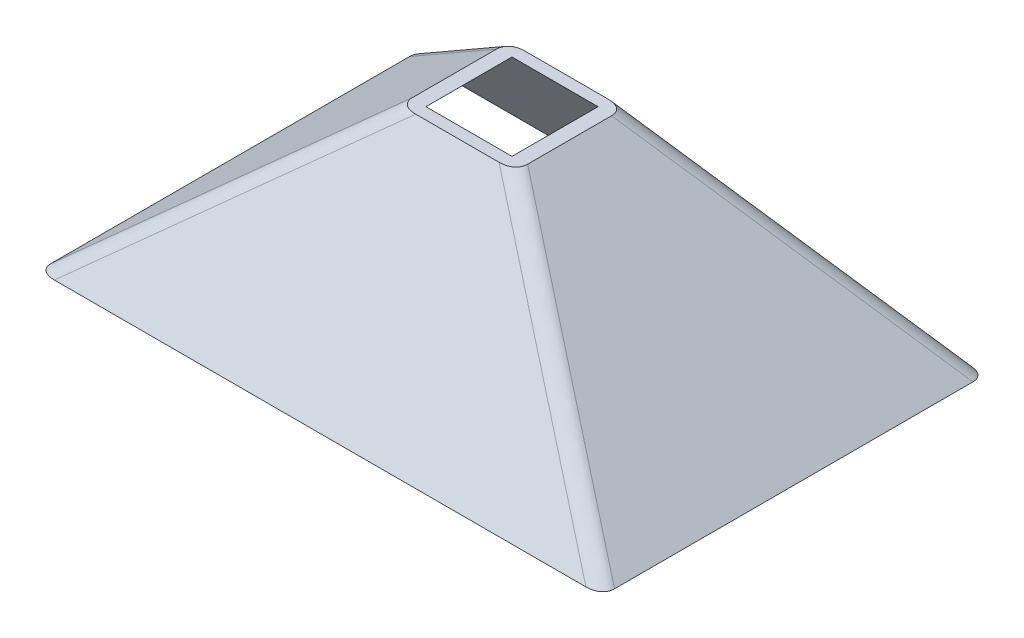
ISO-10303-21;
HEADER;
FILE_DESCRIPTION(('STEP AP214'),'2;1');
FILE_NAME('part.step','',(''),(''),'','','');
FILE_SCHEMA(('AUTOMOTIVE_DESIGN { 1 0 10303 214 1 1 1 1 }'));
ENDSEC;
DATA;
#1=APPLICATION_CONTEXT('core data for automotive mechanical design processes');
#2=APPLICATION_PROTOCOL_DEFINITION('international standard','automotive_design',2000,#1);
#3=PRODUCT_CONTEXT('',#1,'mechanical');
#4=PRODUCT('Part','Part','',(#3));
#5=PRODUCT_RELATED_PRODUCT_CATEGORY('part','',(#4));
#6=PRODUCT_DEFINITION_FORMATION('','',#4);
#7=PRODUCT_DEFINITION_CONTEXT('part definition',#1,'design');
#8=PRODUCT_DEFINITION('design','',#6,#7);
#9=PRODUCT_DEFINITION_SHAPE('','',#8);
#10=(LENGTH_UNIT() NAMED_UNIT(*) SI_UNIT(.MILLI.,.METRE.));
#11=(NAMED_UNIT(*) PLANE_ANGLE_UNIT() SI_UNIT($,.RADIAN.));
#12=(NAMED_UNIT(*) SI_UNIT($,.STERADIAN.) SOLID_ANGLE_UNIT());
#13=UNCERTAINTY_MEASURE_WITH_UNIT(LENGTH_MEASURE(1.E-05),#10,'distance_accuracy_value','');
#14=(GEOMETRIC_REPRESENTATION_CONTEXT(3) GLOBAL_UNCERTAINTY_ASSIGNED_CONTEXT((#13)) GLOBAL_UNIT_ASSIGNED_CONTEXT((#10,
#11,#12)) REPRESENTATION_CONTEXT('',''));
#15=CARTESIAN_POINT('',(0.,0.,0.));
#16=DIRECTION('',(0.,0.,1.));
#17=DIRECTION('',(1.,0.,0.));
#18=AXIS2_PLACEMENT_3D('',#15,#16,#17);
#19=CARTESIAN_POINT('',(850.,-50.,-525.));
#20=DIRECTION('',(0.,1.,0.));
#21=DIRECTION('',(-1.,0.,0.));
#22=AXIS2_PLACEMENT_3D('',#19,#20,#21);
#23=PLANE('',#22);
#24=DIRECTION('',(-1.,0.,0.));
#25=VECTOR('',#24,1.);
#26=CARTESIAN_POINT('',(-850.,-50.0000000000003,51.2791026741974));
#27=LINE('',#26,#25);
#28=CARTESIAN_POINT('',(71.0344398835073,-50.0000000000001,51.2791026741973));
#29=VERTEX_POINT('',#28);
#30=CARTESIAN_POINT('',(-71.0344398835072,-50.0000000000002,51.2791026741973));
#31=VERTEX_POINT('',#30);
#32=EDGE_CURVE('E219',#29,#31,#27,.T.);
#33=ORIENTED_EDGE('',*,*,#32,.T.);
#34=CARTESIAN_POINT('',(-67.4918462685022,-50.0000000000001,45.0780401829455));
#35=DIRECTION('',(0.,1.,0.));
#36=DIRECTION('',(0.852791218594574,0.,-0.522251986581173));
#37=AXIS2_PLACEMENT_3D('',#34,#35,#36);
#38=ELLIPSE('',#37,8.62117853821362,5.);
#39=CARTESIAN_POINT('',(-75.2938680172123,-50.,47.8937006739439));
#40=VERTEX_POINT('',#39);
#41=EDGE_CURVE('E263',#31,#40,#38,.F.);
#42=ORIENTED_EDGE('',*,*,#41,.T.);
#43=DIRECTION('',(0.,0.,-1.));
#44=VECTOR('',#43,1.);
#45=CARTESIAN_POINT('',(-75.2938680172124,-50.,-525.));
#46=LINE('',#45,#44);
#47=CARTESIAN_POINT('',(-75.2938680172123,-50.,-47.8937006739441));
#48=VERTEX_POINT('',#47);
#49=EDGE_CURVE('E224',#40,#48,#46,.T.);
#50=ORIENTED_EDGE('',*,*,#49,.T.);
#51=CARTESIAN_POINT('',(-67.4918462685025,-50.0000000000002,-45.0780401829455));
#52=DIRECTION('',(0.,1.,0.));
#53=DIRECTION('',(0.852791218594574,0.,0.522251986581173));
#54=AXIS2_PLACEMENT_3D('',#51,#52,#53);
#55=ELLIPSE('',#54,8.62117853821362,5.);
#56=CARTESIAN_POINT('',(-71.0344398835074,-50.0000000000002,-51.2791026741973));
#57=VERTEX_POINT('',#56);
#58=EDGE_CURVE('E258',#48,#57,#55,.F.);
#59=ORIENTED_EDGE('',*,*,#58,.T.);
#60=DIRECTION('',(1.,0.,0.));
#61=VECTOR('',#60,1.);
#62=CARTESIAN_POINT('',(849.999999999999,-50.,-51.2791026741972));
#63=LINE('',#62,#61);
#64=CARTESIAN_POINT('',(71.0344398835072,-50.0000000000001,-51.2791026741972));
#65=VERTEX_POINT('',#64);
#66=EDGE_CURVE('E189',#57,#65,#63,.T.);
#67=ORIENTED_EDGE('',*,*,#66,.T.);
#68=CARTESIAN_POINT('',(67.4918462685022,-50.0000000000002,-45.0780401829456));
#69=DIRECTION('',(0.,1.,0.));
#70=DIRECTION('',(-0.852791218594574,0.,0.522251986581174));
#71=AXIS2_PLACEMENT_3D('',#68,#69,#70);
#72=ELLIPSE('',#71,8.62117853821362,5.);
#73=CARTESIAN_POINT('',(75.2938680172124,-50.0000000000002,-47.8937006739442));
#74=VERTEX_POINT('',#73);
#75=EDGE_CURVE('E110',#65,#74,#72,.F.);
#76=ORIENTED_EDGE('',*,*,#75,.T.);
#77=DIRECTION('',(0.,0.,1.));
#78=VECTOR('',#77,1.);
#79=CARTESIAN_POINT('',(75.2938680172125,-50.0000000000002,525.));
#80=LINE('',#79,#78);
#81=CARTESIAN_POINT('',(75.2938680172124,-50.0000000000002,47.8937006739442));
#82=VERTEX_POINT('',#81);
#83=EDGE_CURVE('E223',#74,#82,#80,.T.);
#84=ORIENTED_EDGE('',*,*,#83,.T.);
#85=CARTESIAN_POINT('',(67.4918462685022,-50.0000000000001,45.0780401829456));
#86=DIRECTION('',(0.,1.,0.));
#87=DIRECTION('',(-0.852791218594574,0.,-0.522251986581173));
#88=AXIS2_PLACEMENT_3D('',#85,#86,#87);
#89=ELLIPSE('',#88,8.62117853821362,5.);
#90=EDGE_CURVE('E261',#82,#29,#89,.F.);
#91=ORIENTED_EDGE('',*,*,#90,.T.);
#92=EDGE_LOOP('',(#33,#42,#50,#59,#67,#76,#84,#91));
#93=FACE_BOUND('',#92,.T.);
#94=DIRECTION('',(-1.,0.,0.));
#95=VECTOR('',#94,1.);
#96=CARTESIAN_POINT('',(-850.,-50.0000000000003,48.1785714285716));
#97=LINE('',#96,#95);
#98=CARTESIAN_POINT('',(71.3928571428573,-50.0000000000002,48.1785714285715));
#99=VERTEX_POINT('',#98);
#100=CARTESIAN_POINT('',(-71.3928571428572,-50.,48.1785714285712));
#101=VERTEX_POINT('',#100);
#102=EDGE_CURVE('E203',#99,#101,#97,.T.);
#103=ORIENTED_EDGE('',*,*,#102,.F.);
#104=DIRECTION('',(0.,0.,1.));
#105=VECTOR('',#104,1.);
#106=CARTESIAN_POINT('',(71.3928571428575,-50.0000000000002,525.));
#107=LINE('',#106,#105);
#108=CARTESIAN_POINT('',(71.3928571428571,-50.0000000000001,-48.1785714285714));
#109=VERTEX_POINT('',#108);
#110=EDGE_CURVE('E201',#109,#99,#107,.T.);
#111=ORIENTED_EDGE('',*,*,#110,.F.);
#112=DIRECTION('',(1.,0.,0.));
#113=VECTOR('',#112,1.);
#114=CARTESIAN_POINT('',(849.999999999999,-50.,-48.1785714285713));
#115=LINE('',#114,#113);
#116=CARTESIAN_POINT('',(-71.3928571428573,-50.0000000000002,-48.1785714285716));
#117=VERTEX_POINT('',#116);
#118=EDGE_CURVE('E195',#117,#109,#115,.T.);
#119=ORIENTED_EDGE('',*,*,#118,.F.);
#120=DIRECTION('',(0.,0.,-1.));
#121=VECTOR('',#120,1.);
#122=CARTESIAN_POINT('',(-71.3928571428574,-50.0000000000002,-525.));
#123=LINE('',#122,#121);
#124=EDGE_CURVE('E179',#101,#117,#123,.T.);
#125=ORIENTED_EDGE('',*,*,#124,.F.);
#126=EDGE_LOOP('',(#103,#111,#119,#125));
#127=FACE_BOUND('',#126,.T.);
#128=ADVANCED_FACE('F88',(#93,#127),#23,.F.);
#129=CARTESIAN_POINT('',(-850.,-698.521278753427,527.015783588318));
#130=DIRECTION('',(0.,0.591488498629338,0.806313435327238));
#131=DIRECTION('',(1.,0.,0.));
#132=AXIS2_PLACEMENT_3D('',#129,#130,#131);
#133=PLANE('',#132);
#134=DIRECTION('',(1.,0.,0.));
#135=VECTOR('',#134,1.);
#136=CARTESIAN_POINT('',(0.,0.,14.6005312456257));
#137=LINE('',#136,#135);
#138=CARTESIAN_POINT('',(-11.1415827406499,0.,14.6005312456257));
#139=VERTEX_POINT('',#138);
#140=CARTESIAN_POINT('',(11.1415827406499,0.,14.6005312456257));
#141=VERTEX_POINT('',#140);
#142=EDGE_CURVE('E228',#139,#141,#137,.T.);
#143=ORIENTED_EDGE('',*,*,#142,.F.);
#144=DIRECTION('',(0.694717745113158,0.579967109814204,-0.425447301270849));
#145=VECTOR('',#144,1.);
#146=CARTESIAN_POINT('',(-848.898155680097,-699.379369180218,527.645254208543));
#147=LINE('',#146,#145);
#148=EDGE_CURVE('E256',#139,#31,#147,.F.);
#149=ORIENTED_EDGE('',*,*,#148,.T.);
#150=ORIENTED_EDGE('',*,*,#32,.F.);
#151=DIRECTION('',(-0.694717745113158,0.579967109814205,-0.425447301270849));
#152=VECTOR('',#151,1.);
#153=CARTESIAN_POINT('',(28.4224885424089,-14.426516471355,25.1834115428269));
#154=LINE('',#153,#152);
#155=EDGE_CURVE('E253',#29,#141,#154,.T.);
#156=ORIENTED_EDGE('',*,*,#155,.T.);
#157=EDGE_LOOP('',(#143,#149,#150,#156));
#158=FACE_BOUND('',#157,.T.);
#159=ADVANCED_FACE('F291',(#158),#133,.T.);
#160=CARTESIAN_POINT('',(851.602148827907,-698.080854582572,525.));
#161=DIRECTION('',(0.640859531162751,0.76765816697138,0.));
#162=DIRECTION('',(0.,0.,-1.));
#163=AXIS2_PLACEMENT_3D('',#160,#161,#162);
#164=PLANE('',#163);
#165=DIRECTION('',(0.,0.,-1.));
#166=VECTOR('',#165,1.);
#167=CARTESIAN_POINT('',(15.4010108743551,0.,0.));
#168=LINE('',#167,#166);
#169=CARTESIAN_POINT('',(15.4010108743551,0.,11.2151292453726));
#170=VERTEX_POINT('',#169);
#171=CARTESIAN_POINT('',(15.4010108743551,0.,-11.2151292453726));
#172=VERTEX_POINT('',#171);
#173=EDGE_CURVE('E233',#170,#172,#168,.T.);
#174=ORIENTED_EDGE('',*,*,#173,.F.);
#175=DIRECTION('',(-0.694717745113158,0.579967109814205,-0.425447301270849));
#176=VECTOR('',#175,1.);
#177=CARTESIAN_POINT('',(852.10245333591,-698.498520838507,523.613687031907));
#178=LINE('',#177,#176);
#179=EDGE_CURVE('E103',#170,#82,#178,.F.);
#180=ORIENTED_EDGE('',*,*,#179,.T.);
#181=ORIENTED_EDGE('',*,*,#83,.F.);
#182=DIRECTION('',(-0.694717745113158,0.579967109814205,0.425447301270849));
#183=VECTOR('',#182,1.);
#184=CARTESIAN_POINT('',(541.75837404238,-439.415807057385,-333.558010565326));
#185=LINE('',#184,#183);
#186=EDGE_CURVE('E265',#74,#172,#185,.T.);
#187=ORIENTED_EDGE('',*,*,#186,.T.);
#188=EDGE_LOOP('',(#174,#180,#181,#187));
#189=FACE_BOUND('',#188,.T.);
#190=ADVANCED_FACE('F283',(#189),#164,.T.);
#191=CARTESIAN_POINT('',(850.,-698.521278753427,-527.015783588318));
#192=DIRECTION('',(0.,0.591488498629338,-0.806313435327238));
#193=DIRECTION('',(-1.,0.,0.));
#194=AXIS2_PLACEMENT_3D('',#191,#192,#193);
#195=PLANE('',#194);
#196=DIRECTION('',(-1.,0.,0.));
#197=VECTOR('',#196,1.);
#198=CARTESIAN_POINT('',(0.,0.,-14.6005312456256));
#199=LINE('',#198,#197);
#200=CARTESIAN_POINT('',(11.1415827406499,0.,-14.6005312456256));
#201=VERTEX_POINT('',#200);
#202=CARTESIAN_POINT('',(-11.1415827406501,0.,-14.6005312456256));
#203=VERTEX_POINT('',#202);
#204=EDGE_CURVE('E236',#201,#203,#199,.T.);
#205=ORIENTED_EDGE('',*,*,#204,.F.);
#206=DIRECTION('',(-0.694717745113158,0.579967109814205,0.425447301270849));
#207=VECTOR('',#206,1.);
#208=CARTESIAN_POINT('',(848.898155680096,-699.379369180218,-527.645254208543));
#209=LINE('',#208,#207);
#210=EDGE_CURVE('E12',#201,#65,#209,.F.);
#211=ORIENTED_EDGE('',*,*,#210,.T.);
#212=ORIENTED_EDGE('',*,*,#66,.F.);
#213=DIRECTION('',(0.694717745113158,0.579967109814204,0.425447301270849));
#214=VECTOR('',#213,1.);
#215=CARTESIAN_POINT('',(-28.4224885424093,-14.4265164713553,-25.183411542827));
#216=LINE('',#215,#214);
#217=EDGE_CURVE('E96',#57,#203,#216,.T.);
#218=ORIENTED_EDGE('',*,*,#217,.T.);
#219=EDGE_LOOP('',(#205,#211,#212,#218));
#220=FACE_BOUND('',#219,.T.);
#221=ADVANCED_FACE('F273',(#220),#195,.T.);
#222=CARTESIAN_POINT('',(-851.602148827907,-698.080854582572,-525.));
#223=DIRECTION('',(-0.64085953116275,0.76765816697138,0.));
#224=DIRECTION('',(0.,0.,1.));
#225=AXIS2_PLACEMENT_3D('',#222,#223,#224);
#226=PLANE('',#225);
#227=ORIENTED_EDGE('',*,*,#49,.F.);
#228=DIRECTION('',(0.694717745113158,0.579967109814204,-0.425447301270849));
#229=VECTOR('',#228,1.);
#230=CARTESIAN_POINT('',(-541.75837404238,-439.415807057385,333.558010565326));
#231=LINE('',#230,#229);
#232=CARTESIAN_POINT('',(-15.4010108743551,0.,11.2151292453726));
#233=VERTEX_POINT('',#232);
#234=EDGE_CURVE('E242',#40,#233,#231,.T.);
#235=ORIENTED_EDGE('',*,*,#234,.T.);
#236=DIRECTION('',(0.,0.,1.));
#237=VECTOR('',#236,1.);
#238=CARTESIAN_POINT('',(-15.4010108743551,0.,0.));
#239=LINE('',#238,#237);
#240=CARTESIAN_POINT('',(-15.4010108743551,0.,-11.2151292453725));
#241=VERTEX_POINT('',#240);
#242=EDGE_CURVE('E222',#241,#233,#239,.T.);
#243=ORIENTED_EDGE('',*,*,#242,.F.);
#244=DIRECTION('',(0.694717745113158,0.579967109814204,0.425447301270849));
#245=VECTOR('',#244,1.);
#246=CARTESIAN_POINT('',(-852.10245333591,-698.498520838507,-523.613687031907));
#247=LINE('',#246,#245);
#248=EDGE_CURVE('E227',#241,#48,#247,.F.);
#249=ORIENTED_EDGE('',*,*,#248,.T.);
#250=EDGE_LOOP('',(#227,#235,#243,#249));
#251=FACE_BOUND('',#250,.T.);
#252=ADVANCED_FACE('F299',(#251),#226,.T.);
#253=CARTESIAN_POINT('',(0.,0.,0.));
#254=DIRECTION('',(0.,1.,0.));
#255=DIRECTION('',(0.,0.,1.));
#256=AXIS2_PLACEMENT_3D('',#253,#254,#255);
#257=PLANE('',#256);
#258=DIRECTION('',(1.,0.,0.));
#259=VECTOR('',#258,1.);
#260=CARTESIAN_POINT('',(0.,0.,11.5));
#261=LINE('',#260,#259);
#262=CARTESIAN_POINT('',(-11.5,0.,11.5));
#263=VERTEX_POINT('',#262);
#264=CARTESIAN_POINT('',(11.5,0.,11.5));
#265=VERTEX_POINT('',#264);
#266=EDGE_CURVE('E211',#263,#265,#261,.T.);
#267=ORIENTED_EDGE('',*,*,#266,.F.);
#268=DIRECTION('',(0.,0.,1.));
#269=VECTOR('',#268,1.);
#270=CARTESIAN_POINT('',(-11.5,0.,0.));
#271=LINE('',#270,#269);
#272=CARTESIAN_POINT('',(-11.5,0.,-11.5));
#273=VERTEX_POINT('',#272);
#274=EDGE_CURVE('E207',#273,#263,#271,.T.);
#275=ORIENTED_EDGE('',*,*,#274,.F.);
#276=DIRECTION('',(-1.,0.,0.));
#277=VECTOR('',#276,1.);
#278=CARTESIAN_POINT('',(0.,0.,-11.5));
#279=LINE('',#278,#277);
#280=CARTESIAN_POINT('',(11.5,0.,-11.5));
#281=VERTEX_POINT('',#280);
#282=EDGE_CURVE('E198',#281,#273,#279,.T.);
#283=ORIENTED_EDGE('',*,*,#282,.F.);
#284=DIRECTION('',(0.,0.,-1.));
#285=VECTOR('',#284,1.);
#286=CARTESIAN_POINT('',(11.5,0.,0.));
#287=LINE('',#286,#285);
#288=EDGE_CURVE('E214',#265,#281,#287,.T.);
#289=ORIENTED_EDGE('',*,*,#288,.F.);
#290=EDGE_LOOP('',(#267,#275,#283,#289));
#291=FACE_BOUND('',#290,.T.);
#292=ORIENTED_EDGE('',*,*,#242,.T.);
#293=CARTESIAN_POINT('',(-7.59898912564494,0.,8.39946875437397));
#294=DIRECTION('',(0.,1.,0.));
#295=DIRECTION('',(0.852791218594574,0.,-0.522251986581173));
#296=AXIS2_PLACEMENT_3D('',#293,#294,#295);
#297=ELLIPSE('',#296,8.62117853821362,5.);
#298=EDGE_CURVE('E251',#233,#139,#297,.T.);
#299=ORIENTED_EDGE('',*,*,#298,.T.);
#300=ORIENTED_EDGE('',*,*,#142,.T.);
#301=CARTESIAN_POINT('',(7.59898912564493,0.,8.39946875437406));
#302=DIRECTION('',(0.,1.,0.));
#303=DIRECTION('',(-0.852791218594574,0.,-0.522251986581173));
#304=AXIS2_PLACEMENT_3D('',#301,#302,#303);
#305=ELLIPSE('',#304,8.62117853821362,5.);
#306=EDGE_CURVE('E249',#141,#170,#305,.T.);
#307=ORIENTED_EDGE('',*,*,#306,.T.);
#308=ORIENTED_EDGE('',*,*,#173,.T.);
#309=CARTESIAN_POINT('',(7.59898912564494,0.,-8.39946875437403));
#310=DIRECTION('',(0.,1.,0.));
#311=DIRECTION('',(-0.852791218594574,0.,0.522251986581173));
#312=AXIS2_PLACEMENT_3D('',#309,#310,#311);
#313=ELLIPSE('',#312,8.62117853821362,5.);
#314=EDGE_CURVE('E247',#172,#201,#313,.T.);
#315=ORIENTED_EDGE('',*,*,#314,.T.);
#316=ORIENTED_EDGE('',*,*,#204,.T.);
#317=CARTESIAN_POINT('',(-7.59898912564512,0.,-8.39946875437398));
#318=DIRECTION('',(0.,1.,0.));
#319=DIRECTION('',(0.852791218594574,0.,0.522251986581173));
#320=AXIS2_PLACEMENT_3D('',#317,#318,#319);
#321=ELLIPSE('',#320,8.62117853821362,5.);
#322=EDGE_CURVE('E245',#203,#241,#321,.T.);
#323=ORIENTED_EDGE('',*,*,#322,.T.);
#324=EDGE_LOOP('',(#292,#299,#300,#307,#308,#315,#316,#323));
#325=FACE_BOUND('',#324,.T.);
#326=ADVANCED_FACE('F278',(#291,#325),#257,.T.);
#327=CARTESIAN_POINT('',(-850.,-700.,525.));
#328=DIRECTION('',(0.,0.591488498629338,0.806313435327238));
#329=DIRECTION('',(1.,0.,0.));
#330=AXIS2_PLACEMENT_3D('',#327,#328,#329);
#331=PLANE('',#330);
#332=ORIENTED_EDGE('',*,*,#102,.T.);
#333=DIRECTION('',(0.694717745113158,0.579967109814204,-0.425447301270849));
#334=VECTOR('',#333,1.);
#335=CARTESIAN_POINT('',(-430.75,-350.,268.25));
#336=LINE('',#335,#334);
#337=EDGE_CURVE('E185',#101,#263,#336,.T.);
#338=ORIENTED_EDGE('',*,*,#337,.T.);
#339=ORIENTED_EDGE('',*,*,#266,.T.);
#340=DIRECTION('',(-0.694717745113158,0.579967109814205,-0.425447301270849));
#341=VECTOR('',#340,1.);
#342=CARTESIAN_POINT('',(430.75,-350.,268.25));
#343=LINE('',#342,#341);
#344=EDGE_CURVE('E190',#99,#265,#343,.T.);
#345=ORIENTED_EDGE('',*,*,#344,.F.);
#346=EDGE_LOOP('',(#332,#338,#339,#345));
#347=FACE_BOUND('',#346,.T.);
#348=ADVANCED_FACE('F315',(#347),#331,.F.);
#349=CARTESIAN_POINT('',(850.,-700.,525.));
#350=DIRECTION('',(0.640859531162751,0.76765816697138,0.));
#351=DIRECTION('',(0.,0.,-1.));
#352=AXIS2_PLACEMENT_3D('',#349,#350,#351);
#353=PLANE('',#352);
#354=ORIENTED_EDGE('',*,*,#110,.T.);
#355=ORIENTED_EDGE('',*,*,#344,.T.);
#356=ORIENTED_EDGE('',*,*,#288,.T.);
#357=DIRECTION('',(-0.694717745113158,0.579967109814205,0.425447301270849));
#358=VECTOR('',#357,1.);
#359=CARTESIAN_POINT('',(430.75,-350.,-268.25));
#360=LINE('',#359,#358);
#361=EDGE_CURVE('E199',#109,#281,#360,.T.);
#362=ORIENTED_EDGE('',*,*,#361,.F.);
#363=EDGE_LOOP('',(#354,#355,#356,#362));
#364=FACE_BOUND('',#363,.T.);
#365=ADVANCED_FACE('F382',(#364),#353,.F.);
#366=CARTESIAN_POINT('',(850.,-700.,-525.));
#367=DIRECTION('',(0.,0.591488498629338,-0.806313435327238));
#368=DIRECTION('',(-1.,0.,0.));
#369=AXIS2_PLACEMENT_3D('',#366,#367,#368);
#370=PLANE('',#369);
#371=ORIENTED_EDGE('',*,*,#118,.T.);
#372=ORIENTED_EDGE('',*,*,#361,.T.);
#373=ORIENTED_EDGE('',*,*,#282,.T.);
#374=DIRECTION('',(0.694717745113158,0.579967109814204,0.425447301270849));
#375=VECTOR('',#374,1.);
#376=CARTESIAN_POINT('',(-430.75,-350.,-268.25));
#377=LINE('',#376,#375);
#378=EDGE_CURVE('E183',#117,#273,#377,.T.);
#379=ORIENTED_EDGE('',*,*,#378,.F.);
#380=EDGE_LOOP('',(#371,#372,#373,#379));
#381=FACE_BOUND('',#380,.T.);
#382=ADVANCED_FACE('F194',(#381),#370,.F.);
#383=CARTESIAN_POINT('',(-850.,-700.,-525.));
#384=DIRECTION('',(-0.64085953116275,0.76765816697138,0.));
#385=DIRECTION('',(0.,0.,1.));
#386=AXIS2_PLACEMENT_3D('',#383,#384,#385);
#387=PLANE('',#386);
#388=ORIENTED_EDGE('',*,*,#124,.T.);
#389=ORIENTED_EDGE('',*,*,#378,.T.);
#390=ORIENTED_EDGE('',*,*,#274,.T.);
#391=ORIENTED_EDGE('',*,*,#337,.F.);
#392=EDGE_LOOP('',(#388,#389,#390,#391));
#393=FACE_BOUND('',#392,.T.);
#394=ADVANCED_FACE('F181',(#393),#387,.F.);
#395=CARTESIAN_POINT('',(-538.554076386566,-443.254097892242,333.558010565326));
#396=DIRECTION('',(0.694717745113158,0.579967109814204,-0.425447301270849));
#397=DIRECTION('',(-0.64085953116275,0.76765816697138,0.));
#398=AXIS2_PLACEMENT_3D('',#395,#396,#397);
#399=CYLINDRICAL_SURFACE('',#398,5.);
#400=ORIENTED_EDGE('',*,*,#41,.F.);
#401=ORIENTED_EDGE('',*,*,#148,.F.);
#402=ORIENTED_EDGE('',*,*,#298,.F.);
#403=ORIENTED_EDGE('',*,*,#234,.F.);
#404=EDGE_LOOP('',(#400,#401,#402,#403));
#405=FACE_BOUND('',#404,.T.);
#406=ADVANCED_FACE('F296',(#405),#399,.T.);
#407=CARTESIAN_POINT('',(28.4224885424089,-17.3839589645018,21.1518443661908));
#408=DIRECTION('',(-0.694717745113158,0.579967109814204,-0.425447301270849));
#409=DIRECTION('',(-0.640859531162751,-0.76765816697138,0.));
#410=AXIS2_PLACEMENT_3D('',#407,#408,#409);
#411=CYLINDRICAL_SURFACE('',#410,5.);
#412=ORIENTED_EDGE('',*,*,#90,.F.);
#413=ORIENTED_EDGE('',*,*,#179,.F.);
#414=ORIENTED_EDGE('',*,*,#306,.F.);
#415=ORIENTED_EDGE('',*,*,#155,.F.);
#416=EDGE_LOOP('',(#412,#413,#414,#415));
#417=FACE_BOUND('',#416,.T.);
#418=ADVANCED_FACE('F288',(#417),#411,.T.);
#419=CARTESIAN_POINT('',(538.554076386566,-443.254097892242,-333.558010565326));
#420=DIRECTION('',(-0.694717745113157,0.579967109814204,0.425447301270849));
#421=DIRECTION('',(-0.640859531162751,-0.76765816697138,0.));
#422=AXIS2_PLACEMENT_3D('',#419,#420,#421);
#423=CYLINDRICAL_SURFACE('',#422,5.);
#424=ORIENTED_EDGE('',*,*,#75,.F.);
#425=ORIENTED_EDGE('',*,*,#210,.F.);
#426=ORIENTED_EDGE('',*,*,#314,.F.);
#427=ORIENTED_EDGE('',*,*,#186,.F.);
#428=EDGE_LOOP('',(#424,#425,#426,#427));
#429=FACE_BOUND('',#428,.T.);
#430=ADVANCED_FACE('F282',(#429),#423,.T.);
#431=CARTESIAN_POINT('',(-28.4224885424093,-17.383958964502,-21.1518443661908));
#432=DIRECTION('',(0.694717745113158,0.579967109814204,0.425447301270849));
#433=DIRECTION('',(-0.64085953116275,0.76765816697138,0.));
#434=AXIS2_PLACEMENT_3D('',#431,#432,#433);
#435=CYLINDRICAL_SURFACE('',#434,5.);
#436=ORIENTED_EDGE('',*,*,#58,.F.);
#437=ORIENTED_EDGE('',*,*,#248,.F.);
#438=ORIENTED_EDGE('',*,*,#322,.F.);
#439=ORIENTED_EDGE('',*,*,#217,.F.);
#440=EDGE_LOOP('',(#436,#437,#438,#439));
#441=FACE_BOUND('',#440,.T.);
#442=ADVANCED_FACE('F90',(#441),#435,.T.);
#443=CLOSED_SHELL('',(#128,#159,#190,#221,#252,#326,#348,#365,#382,#394,#406,#418,#430,#442));
#444=MANIFOLD_SOLID_BREP('B2',#443);
#445=ADVANCED_BREP_SHAPE_REPRESENTATION('',(#18,#444),#14);
#446=SHAPE_DEFINITION_REPRESENTATION(#9,#445);
ENDSEC;
END-ISO-10303-21;
